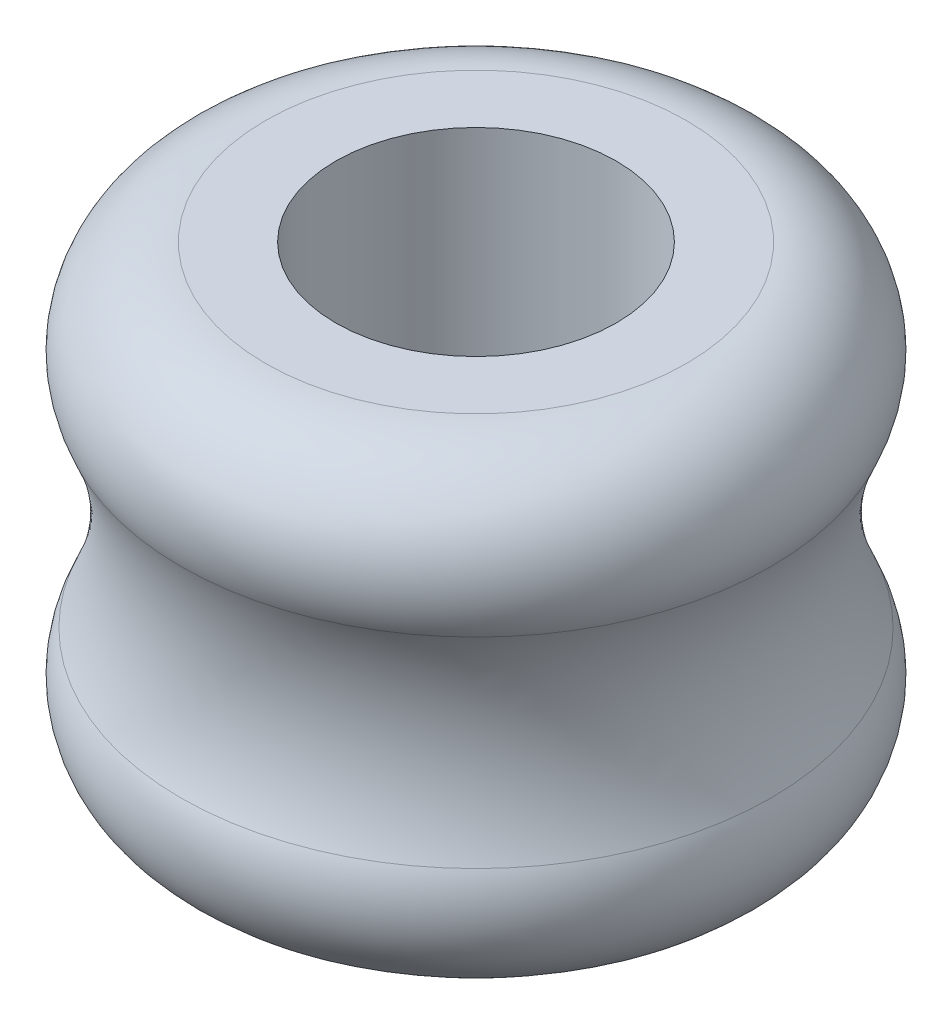
ISO-10303-21;
HEADER;
FILE_DESCRIPTION(('STEP AP214'),'2;1');
FILE_NAME('part.step','',(''),(''),'','','');
FILE_SCHEMA(('AUTOMOTIVE_DESIGN { 1 0 10303 214 1 1 1 1 }'));
ENDSEC;
DATA;
#1=APPLICATION_CONTEXT('core data for automotive mechanical design processes');
#2=APPLICATION_PROTOCOL_DEFINITION('international standard','automotive_design',2000,#1);
#3=PRODUCT_CONTEXT('',#1,'mechanical');
#4=PRODUCT('Part','Part','',(#3));
#5=PRODUCT_RELATED_PRODUCT_CATEGORY('part','',(#4));
#6=PRODUCT_DEFINITION_FORMATION('','',#4);
#7=PRODUCT_DEFINITION_CONTEXT('part definition',#1,'design');
#8=PRODUCT_DEFINITION('design','',#6,#7);
#9=PRODUCT_DEFINITION_SHAPE('','',#8);
#10=(LENGTH_UNIT() NAMED_UNIT(*) SI_UNIT(.MILLI.,.METRE.));
#11=(NAMED_UNIT(*) PLANE_ANGLE_UNIT() SI_UNIT($,.RADIAN.));
#12=(NAMED_UNIT(*) SI_UNIT($,.STERADIAN.) SOLID_ANGLE_UNIT());
#13=UNCERTAINTY_MEASURE_WITH_UNIT(LENGTH_MEASURE(1.E-05),#10,'distance_accuracy_value','');
#14=(GEOMETRIC_REPRESENTATION_CONTEXT(3) GLOBAL_UNCERTAINTY_ASSIGNED_CONTEXT((#13)) GLOBAL_UNIT_ASSIGNED_CONTEXT((#10,
#11,#12)) REPRESENTATION_CONTEXT('',''));
#15=CARTESIAN_POINT('',(0.,0.,0.));
#16=DIRECTION('',(0.,0.,1.));
#17=DIRECTION('',(1.,0.,0.));
#18=AXIS2_PLACEMENT_3D('',#15,#16,#17);
#19=CARTESIAN_POINT('',(0.,0.,0.));
#20=DIRECTION('',(0.,-1.,0.));
#21=DIRECTION('',(1.,0.,0.));
#22=AXIS2_PLACEMENT_3D('',#19,#20,#21);
#23=PLANE('',#22);
#24=CARTESIAN_POINT('',(0.,0.,0.));
#25=DIRECTION('',(0.,-1.,0.));
#26=DIRECTION('',(1.,0.,0.));
#27=AXIS2_PLACEMENT_3D('',#24,#25,#26);
#28=CIRCLE('',#27,3.);
#29=CARTESIAN_POINT('',(3.,0.,0.));
#30=VERTEX_POINT('',#29);
#31=EDGE_CURVE('E61',#30,#30,#28,.T.);
#32=ORIENTED_EDGE('',*,*,#31,.F.);
#33=EDGE_LOOP('',(#32));
#34=FACE_BOUND('',#33,.T.);
#35=CARTESIAN_POINT('',(0.,0.,0.));
#36=DIRECTION('',(0.,1.,0.));
#37=DIRECTION('',(-1.,0.,0.));
#38=AXIS2_PLACEMENT_3D('',#35,#36,#37);
#39=CIRCLE('',#38,4.5);
#40=CARTESIAN_POINT('',(-4.5,0.,0.));
#41=VERTEX_POINT('',#40);
#42=EDGE_CURVE('E10',#41,#41,#39,.T.);
#43=ORIENTED_EDGE('',*,*,#42,.F.);
#44=EDGE_LOOP('',(#43));
#45=FACE_BOUND('',#44,.T.);
#46=ADVANCED_FACE('F37',(#34,#45),#23,.T.);
#47=CARTESIAN_POINT('',(0.,2.,0.));
#48=DIRECTION('',(0.,1.,0.));
#49=DIRECTION('',(-1.,0.,0.));
#50=AXIS2_PLACEMENT_3D('',#47,#48,#49);
#51=TOROIDAL_SURFACE('',#50,4.5,2.);
#52=ORIENTED_EDGE('',*,*,#42,.T.);
#53=EDGE_LOOP('',(#52));
#54=FACE_BOUND('',#53,.T.);
#55=CARTESIAN_POINT('',(0.,2.85714285714286,0.));
#56=DIRECTION('',(0.,1.,0.));
#57=DIRECTION('',(-1.,0.,0.));
#58=AXIS2_PLACEMENT_3D('',#55,#56,#57);
#59=CIRCLE('',#58,6.3070158058105);
#60=CARTESIAN_POINT('',(-6.3070158058105,2.85714285714285,0.));
#61=VERTEX_POINT('',#60);
#62=EDGE_CURVE('E44',#61,#61,#59,.T.);
#63=ORIENTED_EDGE('',*,*,#62,.F.);
#64=EDGE_LOOP('',(#63));
#65=FACE_BOUND('',#64,.T.);
#66=ADVANCED_FACE('F80',(#54,#65),#51,.T.);
#67=CARTESIAN_POINT('',(0.,5.,0.));
#68=DIRECTION('',(0.,1.,0.));
#69=DIRECTION('',(-1.,0.,0.));
#70=AXIS2_PLACEMENT_3D('',#67,#68,#69);
#71=TOROIDAL_SURFACE('',#70,10.8245553203368,5.);
#72=ORIENTED_EDGE('',*,*,#62,.T.);
#73=EDGE_LOOP('',(#72));
#74=FACE_BOUND('',#73,.T.);
#75=CARTESIAN_POINT('',(0.,7.14285714285714,0.));
#76=DIRECTION('',(0.,1.,0.));
#77=DIRECTION('',(-1.,0.,0.));
#78=AXIS2_PLACEMENT_3D('',#75,#76,#77);
#79=CIRCLE('',#78,6.3070158058105);
#80=CARTESIAN_POINT('',(-6.3070158058105,7.14285714285714,0.));
#81=VERTEX_POINT('',#80);
#82=EDGE_CURVE('E49',#81,#81,#79,.T.);
#83=ORIENTED_EDGE('',*,*,#82,.F.);
#84=EDGE_LOOP('',(#83));
#85=FACE_BOUND('',#84,.T.);
#86=ADVANCED_FACE('F84',(#74,#85),#71,.F.);
#87=CARTESIAN_POINT('',(0.,8.,0.));
#88=DIRECTION('',(0.,1.,0.));
#89=DIRECTION('',(-1.,0.,0.));
#90=AXIS2_PLACEMENT_3D('',#87,#88,#89);
#91=TOROIDAL_SURFACE('',#90,4.5,2.);
#92=ORIENTED_EDGE('',*,*,#82,.T.);
#93=EDGE_LOOP('',(#92));
#94=FACE_BOUND('',#93,.T.);
#95=CARTESIAN_POINT('',(0.,10.,0.));
#96=DIRECTION('',(0.,1.,0.));
#97=DIRECTION('',(-1.,0.,0.));
#98=AXIS2_PLACEMENT_3D('',#95,#96,#97);
#99=CIRCLE('',#98,4.5);
#100=CARTESIAN_POINT('',(-4.5,10.,0.));
#101=VERTEX_POINT('',#100);
#102=EDGE_CURVE('E54',#101,#101,#99,.T.);
#103=ORIENTED_EDGE('',*,*,#102,.F.);
#104=EDGE_LOOP('',(#103));
#105=FACE_BOUND('',#104,.T.);
#106=ADVANCED_FACE('F88',(#94,#105),#91,.T.);
#107=CARTESIAN_POINT('',(0.,10.,0.));
#108=DIRECTION('',(0.,1.,0.));
#109=DIRECTION('',(-1.,0.,0.));
#110=AXIS2_PLACEMENT_3D('',#107,#108,#109);
#111=PLANE('',#110);
#112=CARTESIAN_POINT('',(0.,10.,0.));
#113=DIRECTION('',(0.,-1.,0.));
#114=DIRECTION('',(1.,0.,0.));
#115=AXIS2_PLACEMENT_3D('',#112,#113,#114);
#116=CIRCLE('',#115,3.);
#117=CARTESIAN_POINT('',(3.,10.,0.));
#118=VERTEX_POINT('',#117);
#119=EDGE_CURVE('E60',#118,#118,#116,.T.);
#120=ORIENTED_EDGE('',*,*,#119,.T.);
#121=EDGE_LOOP('',(#120));
#122=FACE_BOUND('',#121,.T.);
#123=ORIENTED_EDGE('',*,*,#102,.T.);
#124=EDGE_LOOP('',(#123));
#125=FACE_BOUND('',#124,.T.);
#126=ADVANCED_FACE('F69',(#122,#125),#111,.T.);
#127=CARTESIAN_POINT('',(0.,10.,0.));
#128=DIRECTION('',(0.,-1.,0.));
#129=DIRECTION('',(1.,0.,0.));
#130=AXIS2_PLACEMENT_3D('',#127,#128,#129);
#131=CYLINDRICAL_SURFACE('',#130,3.);
#132=ORIENTED_EDGE('',*,*,#119,.F.);
#133=EDGE_LOOP('',(#132));
#134=FACE_BOUND('',#133,.T.);
#135=ORIENTED_EDGE('',*,*,#31,.T.);
#136=EDGE_LOOP('',(#135));
#137=FACE_BOUND('',#136,.T.);
#138=ADVANCED_FACE('F72',(#134,#137),#131,.F.);
#139=CLOSED_SHELL('',(#46,#66,#86,#106,#126,#138));
#140=MANIFOLD_SOLID_BREP('B2',#139);
#141=ADVANCED_BREP_SHAPE_REPRESENTATION('',(#18,#140),#14);
#142=SHAPE_DEFINITION_REPRESENTATION(#9,#141);
ENDSEC;
END-ISO-10303-21;
